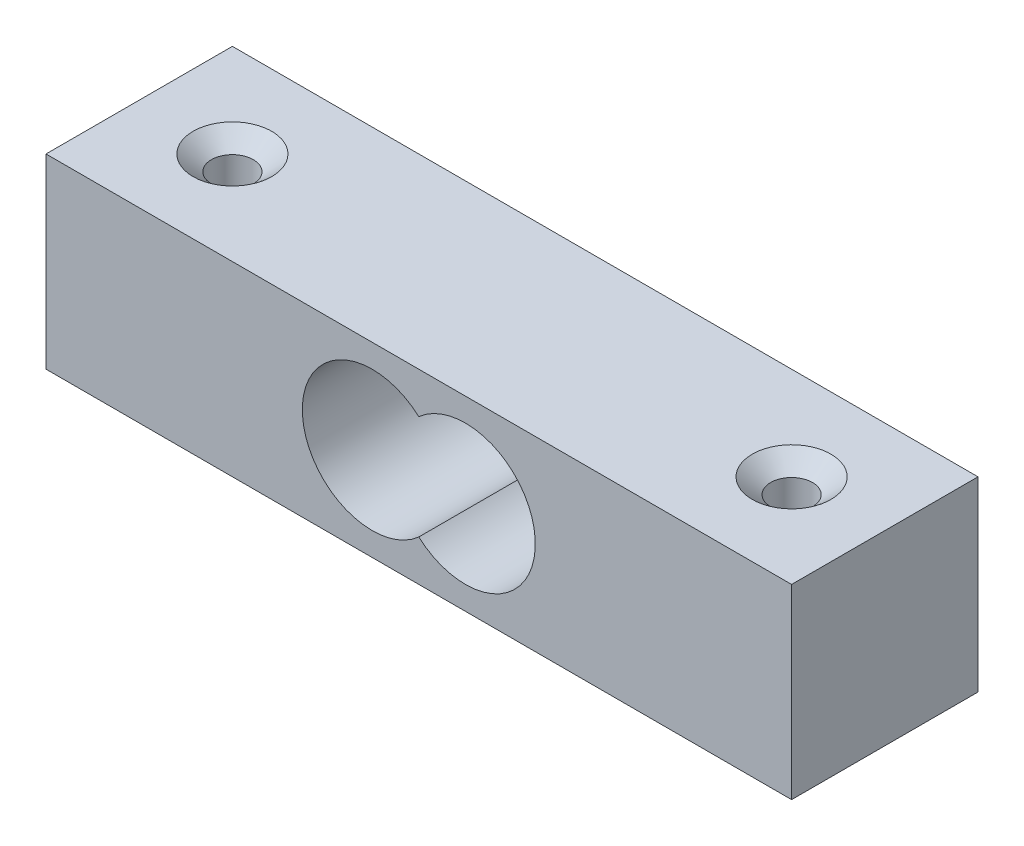
ISO-10303-21;
HEADER;
FILE_DESCRIPTION(('STEP AP214'),'2;1');
FILE_NAME('part.step','',(''),(''),'','','');
FILE_SCHEMA(('AUTOMOTIVE_DESIGN { 1 0 10303 214 1 1 1 1 }'));
ENDSEC;
DATA;
#1=APPLICATION_CONTEXT('core data for automotive mechanical design processes');
#2=APPLICATION_PROTOCOL_DEFINITION('international standard','automotive_design',2000,#1);
#3=PRODUCT_CONTEXT('',#1,'mechanical');
#4=PRODUCT('Part','Part','',(#3));
#5=PRODUCT_RELATED_PRODUCT_CATEGORY('part','',(#4));
#6=PRODUCT_DEFINITION_FORMATION('','',#4);
#7=PRODUCT_DEFINITION_CONTEXT('part definition',#1,'design');
#8=PRODUCT_DEFINITION('design','',#6,#7);
#9=PRODUCT_DEFINITION_SHAPE('','',#8);
#10=(LENGTH_UNIT() NAMED_UNIT(*) SI_UNIT(.MILLI.,.METRE.));
#11=(NAMED_UNIT(*) PLANE_ANGLE_UNIT() SI_UNIT($,.RADIAN.));
#12=(NAMED_UNIT(*) SI_UNIT($,.STERADIAN.) SOLID_ANGLE_UNIT());
#13=UNCERTAINTY_MEASURE_WITH_UNIT(LENGTH_MEASURE(1.E-05),#10,'distance_accuracy_value','');
#14=(GEOMETRIC_REPRESENTATION_CONTEXT(3) GLOBAL_UNCERTAINTY_ASSIGNED_CONTEXT((#13)) GLOBAL_UNIT_ASSIGNED_CONTEXT((#10,
#11,#12)) REPRESENTATION_CONTEXT('',''));
#15=CARTESIAN_POINT('',(0.,0.,0.));
#16=DIRECTION('',(0.,0.,1.));
#17=DIRECTION('',(1.,0.,0.));
#18=AXIS2_PLACEMENT_3D('',#15,#16,#17);
#19=CARTESIAN_POINT('',(40.,20.,10.));
#20=DIRECTION('',(-1.,0.,0.));
#21=DIRECTION('',(0.,0.,1.));
#22=AXIS2_PLACEMENT_3D('',#19,#20,#21);
#23=PLANE('',#22);
#24=DIRECTION('',(0.,0.,-1.));
#25=VECTOR('',#24,1.);
#26=CARTESIAN_POINT('',(40.,0.,10.));
#27=LINE('',#26,#25);
#28=CARTESIAN_POINT('',(40.,0.,10.));
#29=VERTEX_POINT('',#28);
#30=CARTESIAN_POINT('',(40.,0.,-10.));
#31=VERTEX_POINT('',#30);
#32=EDGE_CURVE('E103',#29,#31,#27,.T.);
#33=ORIENTED_EDGE('',*,*,#32,.T.);
#34=DIRECTION('',(0.,-1.,0.));
#35=VECTOR('',#34,1.);
#36=CARTESIAN_POINT('',(40.,20.,-10.));
#37=LINE('',#36,#35);
#38=CARTESIAN_POINT('',(40.,20.,-10.));
#39=VERTEX_POINT('',#38);
#40=EDGE_CURVE('E11',#39,#31,#37,.T.);
#41=ORIENTED_EDGE('',*,*,#40,.F.);
#42=DIRECTION('',(0.,0.,-1.));
#43=VECTOR('',#42,1.);
#44=CARTESIAN_POINT('',(40.,20.,10.));
#45=LINE('',#44,#43);
#46=CARTESIAN_POINT('',(40.,20.,10.));
#47=VERTEX_POINT('',#46);
#48=EDGE_CURVE('E105',#47,#39,#45,.T.);
#49=ORIENTED_EDGE('',*,*,#48,.F.);
#50=DIRECTION('',(0.,-1.,0.));
#51=VECTOR('',#50,1.);
#52=CARTESIAN_POINT('',(40.,20.,10.));
#53=LINE('',#52,#51);
#54=EDGE_CURVE('E115',#47,#29,#53,.T.);
#55=ORIENTED_EDGE('',*,*,#54,.T.);
#56=EDGE_LOOP('',(#33,#41,#49,#55));
#57=FACE_BOUND('',#56,.T.);
#58=ADVANCED_FACE('F32',(#57),#23,.F.);
#59=CARTESIAN_POINT('',(-40.,20.,-10.));
#60=DIRECTION('',(0.,0.,1.));
#61=DIRECTION('',(1.,0.,0.));
#62=AXIS2_PLACEMENT_3D('',#59,#60,#61);
#63=PLANE('',#62);
#64=CARTESIAN_POINT('',(-5.,10.,-10.));
#65=DIRECTION('',(0.,0.,1.));
#66=DIRECTION('',(1.,0.,0.));
#67=AXIS2_PLACEMENT_3D('',#64,#65,#66);
#68=CIRCLE('',#67,7.50000000000001);
#69=CARTESIAN_POINT('',(0.,15.5901699437495,-10.));
#70=VERTEX_POINT('',#69);
#71=CARTESIAN_POINT('',(0.,4.40983005625052,-10.));
#72=VERTEX_POINT('',#71);
#73=EDGE_CURVE('E87',#70,#72,#68,.T.);
#74=ORIENTED_EDGE('',*,*,#73,.T.);
#75=CARTESIAN_POINT('',(5.,10.,-10.));
#76=DIRECTION('',(0.,0.,1.));
#77=DIRECTION('',(1.,0.,0.));
#78=AXIS2_PLACEMENT_3D('',#75,#76,#77);
#79=CIRCLE('',#78,7.5);
#80=EDGE_CURVE('E46',#72,#70,#79,.T.);
#81=ORIENTED_EDGE('',*,*,#80,.T.);
#82=EDGE_LOOP('',(#74,#81));
#83=FACE_BOUND('',#82,.T.);
#84=DIRECTION('',(-1.,0.,0.));
#85=VECTOR('',#84,1.);
#86=CARTESIAN_POINT('',(-40.,0.,-10.));
#87=LINE('',#86,#85);
#88=CARTESIAN_POINT('',(-40.,0.,-10.));
#89=VERTEX_POINT('',#88);
#90=EDGE_CURVE('E118',#31,#89,#87,.T.);
#91=ORIENTED_EDGE('',*,*,#90,.T.);
#92=DIRECTION('',(0.,-1.,0.));
#93=VECTOR('',#92,1.);
#94=CARTESIAN_POINT('',(-40.,20.,-10.));
#95=LINE('',#94,#93);
#96=CARTESIAN_POINT('',(-40.,20.,-10.));
#97=VERTEX_POINT('',#96);
#98=EDGE_CURVE('E39',#97,#89,#95,.T.);
#99=ORIENTED_EDGE('',*,*,#98,.F.);
#100=DIRECTION('',(-1.,0.,0.));
#101=VECTOR('',#100,1.);
#102=CARTESIAN_POINT('',(-40.,20.,-10.));
#103=LINE('',#102,#101);
#104=EDGE_CURVE('E108',#39,#97,#103,.T.);
#105=ORIENTED_EDGE('',*,*,#104,.F.);
#106=ORIENTED_EDGE('',*,*,#40,.T.);
#107=EDGE_LOOP('',(#91,#99,#105,#106));
#108=FACE_BOUND('',#107,.T.);
#109=ADVANCED_FACE('F93',(#83,#108),#63,.F.);
#110=CARTESIAN_POINT('',(-40.,20.,10.));
#111=DIRECTION('',(1.,0.,0.));
#112=DIRECTION('',(0.,0.,-1.));
#113=AXIS2_PLACEMENT_3D('',#110,#111,#112);
#114=PLANE('',#113);
#115=DIRECTION('',(0.,0.,1.));
#116=VECTOR('',#115,1.);
#117=CARTESIAN_POINT('',(-40.,0.,10.));
#118=LINE('',#117,#116);
#119=CARTESIAN_POINT('',(-40.,0.,10.));
#120=VERTEX_POINT('',#119);
#121=EDGE_CURVE('E120',#89,#120,#118,.T.);
#122=ORIENTED_EDGE('',*,*,#121,.T.);
#123=DIRECTION('',(0.,-1.,0.));
#124=VECTOR('',#123,1.);
#125=CARTESIAN_POINT('',(-40.,20.,10.));
#126=LINE('',#125,#124);
#127=CARTESIAN_POINT('',(-40.,20.,10.));
#128=VERTEX_POINT('',#127);
#129=EDGE_CURVE('E125',#128,#120,#126,.T.);
#130=ORIENTED_EDGE('',*,*,#129,.F.);
#131=DIRECTION('',(0.,0.,1.));
#132=VECTOR('',#131,1.);
#133=CARTESIAN_POINT('',(-40.,20.,10.));
#134=LINE('',#133,#132);
#135=EDGE_CURVE('E111',#97,#128,#134,.T.);
#136=ORIENTED_EDGE('',*,*,#135,.F.);
#137=ORIENTED_EDGE('',*,*,#98,.T.);
#138=EDGE_LOOP('',(#122,#130,#136,#137));
#139=FACE_BOUND('',#138,.T.);
#140=ADVANCED_FACE('F132',(#139),#114,.F.);
#141=CARTESIAN_POINT('',(-40.,20.,10.));
#142=DIRECTION('',(0.,0.,-1.));
#143=DIRECTION('',(-1.,0.,0.));
#144=AXIS2_PLACEMENT_3D('',#141,#142,#143);
#145=PLANE('',#144);
#146=CARTESIAN_POINT('',(-5.,10.,10.));
#147=DIRECTION('',(0.,0.,1.));
#148=DIRECTION('',(1.,0.,0.));
#149=AXIS2_PLACEMENT_3D('',#146,#147,#148);
#150=CIRCLE('',#149,7.50000000000001);
#151=CARTESIAN_POINT('',(0.,15.5901699437495,10.));
#152=VERTEX_POINT('',#151);
#153=CARTESIAN_POINT('',(0.,4.40983005625052,10.));
#154=VERTEX_POINT('',#153);
#155=EDGE_CURVE('E95',#152,#154,#150,.T.);
#156=ORIENTED_EDGE('',*,*,#155,.F.);
#157=CARTESIAN_POINT('',(5.,10.,10.));
#158=DIRECTION('',(0.,0.,1.));
#159=DIRECTION('',(1.,0.,0.));
#160=AXIS2_PLACEMENT_3D('',#157,#158,#159);
#161=CIRCLE('',#160,7.5);
#162=EDGE_CURVE('E51',#154,#152,#161,.T.);
#163=ORIENTED_EDGE('',*,*,#162,.F.);
#164=EDGE_LOOP('',(#156,#163));
#165=FACE_BOUND('',#164,.T.);
#166=DIRECTION('',(1.,0.,0.));
#167=VECTOR('',#166,1.);
#168=CARTESIAN_POINT('',(-40.,0.,10.));
#169=LINE('',#168,#167);
#170=EDGE_CURVE('E109',#120,#29,#169,.T.);
#171=ORIENTED_EDGE('',*,*,#170,.T.);
#172=ORIENTED_EDGE('',*,*,#54,.F.);
#173=DIRECTION('',(1.,0.,0.));
#174=VECTOR('',#173,1.);
#175=CARTESIAN_POINT('',(-40.,20.,10.));
#176=LINE('',#175,#174);
#177=EDGE_CURVE('E113',#128,#47,#176,.T.);
#178=ORIENTED_EDGE('',*,*,#177,.F.);
#179=ORIENTED_EDGE('',*,*,#129,.T.);
#180=EDGE_LOOP('',(#171,#172,#178,#179));
#181=FACE_BOUND('',#180,.T.);
#182=ADVANCED_FACE('F140',(#165,#181),#145,.F.);
#183=CARTESIAN_POINT('',(0.,20.,0.));
#184=DIRECTION('',(0.,-1.,0.));
#185=DIRECTION('',(0.,0.,-1.));
#186=AXIS2_PLACEMENT_3D('',#183,#184,#185);
#187=PLANE('',#186);
#188=CARTESIAN_POINT('',(-30.,20.,0.));
#189=DIRECTION('',(0.,1.,0.));
#190=DIRECTION('',(0.,0.,1.));
#191=AXIS2_PLACEMENT_3D('',#188,#189,#190);
#192=CIRCLE('',#191,4.2164);
#193=CARTESIAN_POINT('',(-30.,20.,4.21639999999999));
#194=VERTEX_POINT('',#193);
#195=EDGE_CURVE('E190',#194,#194,#192,.T.);
#196=ORIENTED_EDGE('',*,*,#195,.F.);
#197=EDGE_LOOP('',(#196));
#198=FACE_BOUND('',#197,.T.);
#199=CARTESIAN_POINT('',(30.,20.,0.));
#200=DIRECTION('',(0.,1.,0.));
#201=DIRECTION('',(0.,0.,1.));
#202=AXIS2_PLACEMENT_3D('',#199,#200,#201);
#203=CIRCLE('',#202,4.2164);
#204=CARTESIAN_POINT('',(30.,20.,4.21639999999999));
#205=VERTEX_POINT('',#204);
#206=EDGE_CURVE('E197',#205,#205,#203,.T.);
#207=ORIENTED_EDGE('',*,*,#206,.F.);
#208=EDGE_LOOP('',(#207));
#209=FACE_BOUND('',#208,.T.);
#210=ORIENTED_EDGE('',*,*,#48,.T.);
#211=ORIENTED_EDGE('',*,*,#104,.T.);
#212=ORIENTED_EDGE('',*,*,#135,.T.);
#213=ORIENTED_EDGE('',*,*,#177,.T.);
#214=EDGE_LOOP('',(#210,#211,#212,#213));
#215=FACE_BOUND('',#214,.T.);
#216=ADVANCED_FACE('F146',(#198,#209,#215),#187,.F.);
#217=CARTESIAN_POINT('',(0.,0.,0.));
#218=DIRECTION('',(0.,-1.,0.));
#219=DIRECTION('',(0.,0.,-1.));
#220=AXIS2_PLACEMENT_3D('',#217,#218,#219);
#221=PLANE('',#220);
#222=CARTESIAN_POINT('',(-30.,0.,0.));
#223=DIRECTION('',(0.,1.,0.));
#224=DIRECTION('',(0.,0.,1.));
#225=AXIS2_PLACEMENT_3D('',#222,#223,#224);
#226=CIRCLE('',#225,2.24789999999999);
#227=CARTESIAN_POINT('',(-30.,0.,2.24789999999999));
#228=VERTEX_POINT('',#227);
#229=EDGE_CURVE('E192',#228,#228,#226,.T.);
#230=ORIENTED_EDGE('',*,*,#229,.T.);
#231=EDGE_LOOP('',(#230));
#232=FACE_BOUND('',#231,.T.);
#233=CARTESIAN_POINT('',(30.,0.,0.));
#234=DIRECTION('',(0.,1.,0.));
#235=DIRECTION('',(0.,0.,1.));
#236=AXIS2_PLACEMENT_3D('',#233,#234,#235);
#237=CIRCLE('',#236,2.2479);
#238=CARTESIAN_POINT('',(30.,0.,2.24789999999998));
#239=VERTEX_POINT('',#238);
#240=EDGE_CURVE('E99',#239,#239,#237,.T.);
#241=ORIENTED_EDGE('',*,*,#240,.T.);
#242=EDGE_LOOP('',(#241));
#243=FACE_BOUND('',#242,.T.);
#244=ORIENTED_EDGE('',*,*,#32,.F.);
#245=ORIENTED_EDGE('',*,*,#170,.F.);
#246=ORIENTED_EDGE('',*,*,#121,.F.);
#247=ORIENTED_EDGE('',*,*,#90,.F.);
#248=EDGE_LOOP('',(#244,#245,#246,#247));
#249=FACE_BOUND('',#248,.T.);
#250=ADVANCED_FACE('F137',(#232,#243,#249),#221,.T.);
#251=CARTESIAN_POINT('',(5.,10.,-10.));
#252=DIRECTION('',(0.,0.,1.));
#253=DIRECTION('',(1.,0.,0.));
#254=AXIS2_PLACEMENT_3D('',#251,#252,#253);
#255=CYLINDRICAL_SURFACE('',#254,7.5);
#256=ORIENTED_EDGE('',*,*,#162,.T.);
#257=DIRECTION('',(0.,0.,1.));
#258=VECTOR('',#257,1.);
#259=CARTESIAN_POINT('',(0.,15.5901699437495,-10.));
#260=LINE('',#259,#258);
#261=EDGE_CURVE('E80',#70,#152,#260,.T.);
#262=ORIENTED_EDGE('',*,*,#261,.F.);
#263=ORIENTED_EDGE('',*,*,#80,.F.);
#264=DIRECTION('',(0.,0.,1.));
#265=VECTOR('',#264,1.);
#266=CARTESIAN_POINT('',(0.,4.40983005625052,-10.));
#267=LINE('',#266,#265);
#268=EDGE_CURVE('E86',#72,#154,#267,.T.);
#269=ORIENTED_EDGE('',*,*,#268,.T.);
#270=EDGE_LOOP('',(#256,#262,#263,#269));
#271=FACE_BOUND('',#270,.T.);
#272=ADVANCED_FACE('F82',(#271),#255,.F.);
#273=CARTESIAN_POINT('',(-5.,10.,-10.));
#274=DIRECTION('',(0.,0.,1.));
#275=DIRECTION('',(1.,0.,0.));
#276=AXIS2_PLACEMENT_3D('',#273,#274,#275);
#277=CYLINDRICAL_SURFACE('',#276,7.50000000000001);
#278=ORIENTED_EDGE('',*,*,#155,.T.);
#279=ORIENTED_EDGE('',*,*,#268,.F.);
#280=ORIENTED_EDGE('',*,*,#73,.F.);
#281=ORIENTED_EDGE('',*,*,#261,.T.);
#282=EDGE_LOOP('',(#278,#279,#280,#281));
#283=FACE_BOUND('',#282,.T.);
#284=ADVANCED_FACE('F90',(#283),#277,.F.);
#285=CARTESIAN_POINT('',(30.,20.,0.));
#286=DIRECTION('',(0.,1.,0.));
#287=DIRECTION('',(0.,0.,1.));
#288=AXIS2_PLACEMENT_3D('',#285,#286,#287);
#289=CYLINDRICAL_SURFACE('',#288,2.2479);
#290=ORIENTED_EDGE('',*,*,#240,.F.);
#291=EDGE_LOOP('',(#290));
#292=FACE_BOUND('',#291,.T.);
#293=CARTESIAN_POINT('',(30.,18.3482323760275,0.));
#294=DIRECTION('',(0.,1.,0.));
#295=DIRECTION('',(0.,0.,1.));
#296=AXIS2_PLACEMENT_3D('',#293,#294,#295);
#297=CIRCLE('',#296,2.2479);
#298=CARTESIAN_POINT('',(30.,18.3482323760275,2.24789999999998));
#299=VERTEX_POINT('',#298);
#300=EDGE_CURVE('E199',#299,#299,#297,.T.);
#301=ORIENTED_EDGE('',*,*,#300,.T.);
#302=EDGE_LOOP('',(#301));
#303=FACE_BOUND('',#302,.T.);
#304=ADVANCED_FACE('F167',(#292,#303),#289,.F.);
#305=CARTESIAN_POINT('',(30.,20.,0.));
#306=DIRECTION('',(0.,1.,0.));
#307=DIRECTION('',(0.,0.,1.));
#308=AXIS2_PLACEMENT_3D('',#305,#306,#307);
#309=CONICAL_SURFACE('',#308,4.2164,0.872664625997165);
#310=ORIENTED_EDGE('',*,*,#300,.F.);
#311=EDGE_LOOP('',(#310));
#312=FACE_BOUND('',#311,.T.);
#313=ORIENTED_EDGE('',*,*,#206,.T.);
#314=EDGE_LOOP('',(#313));
#315=FACE_BOUND('',#314,.T.);
#316=ADVANCED_FACE('F170',(#312,#315),#309,.F.);
#317=CARTESIAN_POINT('',(-30.,20.,0.));
#318=DIRECTION('',(0.,1.,0.));
#319=DIRECTION('',(0.,0.,1.));
#320=AXIS2_PLACEMENT_3D('',#317,#318,#319);
#321=CYLINDRICAL_SURFACE('',#320,2.2479);
#322=ORIENTED_EDGE('',*,*,#229,.F.);
#323=EDGE_LOOP('',(#322));
#324=FACE_BOUND('',#323,.T.);
#325=CARTESIAN_POINT('',(-30.,18.3482323760275,0.));
#326=DIRECTION('',(0.,1.,0.));
#327=DIRECTION('',(0.,0.,1.));
#328=AXIS2_PLACEMENT_3D('',#325,#326,#327);
#329=CIRCLE('',#328,2.2479);
#330=CARTESIAN_POINT('',(-30.,18.3482323760275,2.24789999999999));
#331=VERTEX_POINT('',#330);
#332=EDGE_CURVE('E187',#331,#331,#329,.T.);
#333=ORIENTED_EDGE('',*,*,#332,.T.);
#334=EDGE_LOOP('',(#333));
#335=FACE_BOUND('',#334,.T.);
#336=ADVANCED_FACE('F174',(#324,#335),#321,.F.);
#337=CARTESIAN_POINT('',(-30.,20.,0.));
#338=DIRECTION('',(0.,1.,0.));
#339=DIRECTION('',(0.,0.,1.));
#340=AXIS2_PLACEMENT_3D('',#337,#338,#339);
#341=CONICAL_SURFACE('',#340,4.2164,0.872664625997165);
#342=ORIENTED_EDGE('',*,*,#332,.F.);
#343=EDGE_LOOP('',(#342));
#344=FACE_BOUND('',#343,.T.);
#345=ORIENTED_EDGE('',*,*,#195,.T.);
#346=EDGE_LOOP('',(#345));
#347=FACE_BOUND('',#346,.T.);
#348=ADVANCED_FACE('F178',(#344,#347),#341,.F.);
#349=CLOSED_SHELL('',(#58,#109,#140,#182,#216,#250,#272,#284,#304,#316,#336,#348));
#350=MANIFOLD_SOLID_BREP('B2',#349);
#351=ADVANCED_BREP_SHAPE_REPRESENTATION('',(#18,#350),#14);
#352=SHAPE_DEFINITION_REPRESENTATION(#9,#351);
ENDSEC;
END-ISO-10303-21;
